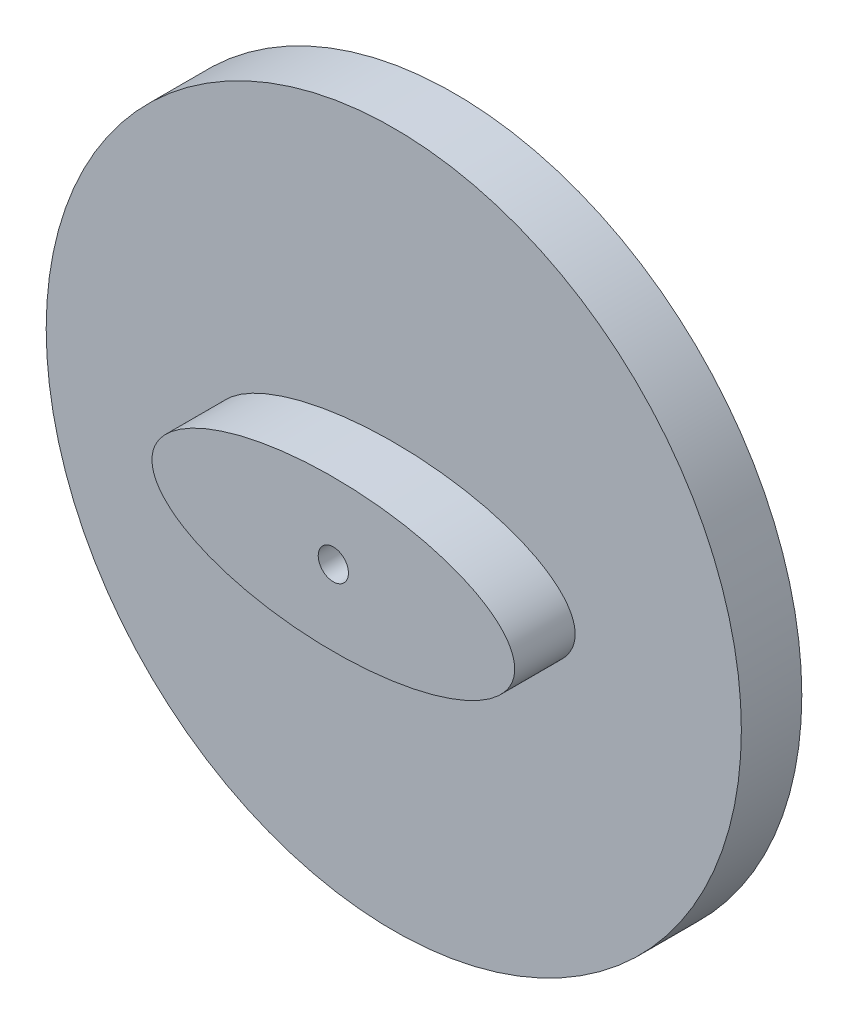
ISO-10303-21;
HEADER;
FILE_DESCRIPTION(('STEP AP214'),'2;1');
FILE_NAME('part.step','',(''),(''),'','','');
FILE_SCHEMA(('AUTOMOTIVE_DESIGN { 1 0 10303 214 1 1 1 1 }'));
ENDSEC;
DATA;
#1=APPLICATION_CONTEXT('core data for automotive mechanical design processes');
#2=APPLICATION_PROTOCOL_DEFINITION('international standard','automotive_design',2000,#1);
#3=PRODUCT_CONTEXT('',#1,'mechanical');
#4=PRODUCT('Part','Part','',(#3));
#5=PRODUCT_RELATED_PRODUCT_CATEGORY('part','',(#4));
#6=PRODUCT_DEFINITION_FORMATION('','',#4);
#7=PRODUCT_DEFINITION_CONTEXT('part definition',#1,'design');
#8=PRODUCT_DEFINITION('design','',#6,#7);
#9=PRODUCT_DEFINITION_SHAPE('','',#8);
#10=(LENGTH_UNIT() NAMED_UNIT(*) SI_UNIT(.MILLI.,.METRE.));
#11=(NAMED_UNIT(*) PLANE_ANGLE_UNIT() SI_UNIT($,.RADIAN.));
#12=(NAMED_UNIT(*) SI_UNIT($,.STERADIAN.) SOLID_ANGLE_UNIT());
#13=UNCERTAINTY_MEASURE_WITH_UNIT(LENGTH_MEASURE(1.E-05),#10,'distance_accuracy_value','');
#14=(GEOMETRIC_REPRESENTATION_CONTEXT(3) GLOBAL_UNCERTAINTY_ASSIGNED_CONTEXT((#13)) GLOBAL_UNIT_ASSIGNED_CONTEXT((#10,
#11,#12)) REPRESENTATION_CONTEXT('',''));
#15=CARTESIAN_POINT('',(0.,0.,0.));
#16=DIRECTION('',(0.,0.,1.));
#17=DIRECTION('',(1.,0.,0.));
#18=AXIS2_PLACEMENT_3D('',#15,#16,#17);
#19=CARTESIAN_POINT('',(0.,0.,2.));
#20=DIRECTION('',(0.,0.,-1.));
#21=DIRECTION('',(-1.,0.,0.));
#22=AXIS2_PLACEMENT_3D('',#19,#20,#21);
#23=CYLINDRICAL_SURFACE('',#22,11.5);
#24=CARTESIAN_POINT('',(0.,0.,2.));
#25=DIRECTION('',(0.,0.,1.));
#26=DIRECTION('',(1.,0.,0.));
#27=AXIS2_PLACEMENT_3D('',#24,#25,#26);
#28=CIRCLE('',#27,11.5);
#29=CARTESIAN_POINT('',(11.5,0.,2.));
#30=VERTEX_POINT('',#29);
#31=EDGE_CURVE('E45',#30,#30,#28,.T.);
#32=ORIENTED_EDGE('',*,*,#31,.F.);
#33=EDGE_LOOP('',(#32));
#34=FACE_BOUND('',#33,.T.);
#35=CARTESIAN_POINT('',(0.,0.,0.));
#36=DIRECTION('',(0.,0.,1.));
#37=DIRECTION('',(1.,0.,0.));
#38=AXIS2_PLACEMENT_3D('',#35,#36,#37);
#39=CIRCLE('',#38,11.5);
#40=CARTESIAN_POINT('',(11.5,0.,0.));
#41=VERTEX_POINT('',#40);
#42=EDGE_CURVE('E40',#41,#41,#39,.T.);
#43=ORIENTED_EDGE('',*,*,#42,.T.);
#44=EDGE_LOOP('',(#43));
#45=FACE_BOUND('',#44,.T.);
#46=ADVANCED_FACE('F37',(#34,#45),#23,.T.);
#47=CARTESIAN_POINT('',(0.,0.,2.));
#48=DIRECTION('',(0.,0.,1.));
#49=DIRECTION('',(1.,0.,0.));
#50=AXIS2_PLACEMENT_3D('',#47,#48,#49);
#51=PLANE('',#50);
#52=CARTESIAN_POINT('',(0.,0.,2.));
#53=DIRECTION('',(0.,0.,1.));
#54=DIRECTION('',(1.,0.,0.));
#55=AXIS2_PLACEMENT_3D('',#52,#53,#54);
#56=ELLIPSE('',#55,6.,2.5);
#57=CARTESIAN_POINT('',(6.,0.,2.));
#58=VERTEX_POINT('',#57);
#59=EDGE_CURVE('E10',#58,#58,#56,.T.);
#60=ORIENTED_EDGE('',*,*,#59,.F.);
#61=EDGE_LOOP('',(#60));
#62=FACE_BOUND('',#61,.T.);
#63=ORIENTED_EDGE('',*,*,#31,.T.);
#64=EDGE_LOOP('',(#63));
#65=FACE_BOUND('',#64,.T.);
#66=ADVANCED_FACE('F69',(#62,#65),#51,.T.);
#67=CARTESIAN_POINT('',(0.,0.,0.));
#68=DIRECTION('',(0.,0.,1.));
#69=DIRECTION('',(1.,0.,0.));
#70=AXIS2_PLACEMENT_3D('',#67,#68,#69);
#71=PLANE('',#70);
#72=CARTESIAN_POINT('',(0.,0.,0.));
#73=DIRECTION('',(0.,0.,-1.));
#74=DIRECTION('',(-1.,0.,0.));
#75=AXIS2_PLACEMENT_3D('',#72,#73,#74);
#76=CIRCLE('',#75,0.5);
#77=CARTESIAN_POINT('',(-0.5,0.,0.));
#78=VERTEX_POINT('',#77);
#79=EDGE_CURVE('E58',#78,#78,#76,.T.);
#80=ORIENTED_EDGE('',*,*,#79,.F.);
#81=EDGE_LOOP('',(#80));
#82=FACE_BOUND('',#81,.T.);
#83=ORIENTED_EDGE('',*,*,#42,.F.);
#84=EDGE_LOOP('',(#83));
#85=FACE_BOUND('',#84,.T.);
#86=ADVANCED_FACE('F66',(#82,#85),#71,.F.);
#87=CARTESIAN_POINT('',(0.,0.,4.));
#88=DIRECTION('',(0.,0.,1.));
#89=DIRECTION('',(1.,0.,0.));
#90=AXIS2_PLACEMENT_3D('',#87,#88,#89);
#91=ELLIPSE('',#90,6.,2.5);
#92=DIRECTION('',(0.,0.,-1.));
#93=VECTOR('',#92,1.);
#94=SURFACE_OF_LINEAR_EXTRUSION('',#91,#93);
#95=CARTESIAN_POINT('',(6.,0.,4.));
#96=VERTEX_POINT('',#95);
#97=EDGE_CURVE('E52',#96,#96,#91,.T.);
#98=ORIENTED_EDGE('',*,*,#97,.F.);
#99=EDGE_LOOP('',(#98));
#100=FACE_BOUND('',#99,.T.);
#101=ORIENTED_EDGE('',*,*,#59,.T.);
#102=EDGE_LOOP('',(#101));
#103=FACE_BOUND('',#102,.T.);
#104=ADVANCED_FACE('F61',(#100,#103),#94,.F.);
#105=CARTESIAN_POINT('',(0.,0.,4.));
#106=DIRECTION('',(0.,0.,1.));
#107=DIRECTION('',(1.,0.,0.));
#108=AXIS2_PLACEMENT_3D('',#105,#106,#107);
#109=PLANE('',#108);
#110=CARTESIAN_POINT('',(0.,0.,4.));
#111=DIRECTION('',(0.,0.,-1.));
#112=DIRECTION('',(-1.,0.,0.));
#113=AXIS2_PLACEMENT_3D('',#110,#111,#112);
#114=CIRCLE('',#113,0.5);
#115=CARTESIAN_POINT('',(-0.5,0.,4.));
#116=VERTEX_POINT('',#115);
#117=EDGE_CURVE('E57',#116,#116,#114,.T.);
#118=ORIENTED_EDGE('',*,*,#117,.T.);
#119=EDGE_LOOP('',(#118));
#120=FACE_BOUND('',#119,.T.);
#121=ORIENTED_EDGE('',*,*,#97,.T.);
#122=EDGE_LOOP('',(#121));
#123=FACE_BOUND('',#122,.T.);
#124=ADVANCED_FACE('F65',(#120,#123),#109,.T.);
#125=CARTESIAN_POINT('',(0.,0.,4.));
#126=DIRECTION('',(0.,0.,-1.));
#127=DIRECTION('',(-1.,0.,0.));
#128=AXIS2_PLACEMENT_3D('',#125,#126,#127);
#129=CYLINDRICAL_SURFACE('',#128,0.5);
#130=ORIENTED_EDGE('',*,*,#117,.F.);
#131=EDGE_LOOP('',(#130));
#132=FACE_BOUND('',#131,.T.);
#133=ORIENTED_EDGE('',*,*,#79,.T.);
#134=EDGE_LOOP('',(#133));
#135=FACE_BOUND('',#134,.T.);
#136=ADVANCED_FACE('F92',(#132,#135),#129,.F.);
#137=CLOSED_SHELL('',(#46,#66,#86,#104,#124,#136));
#138=MANIFOLD_SOLID_BREP('B2',#137);
#139=ADVANCED_BREP_SHAPE_REPRESENTATION('',(#18,#138),#14);
#140=SHAPE_DEFINITION_REPRESENTATION(#9,#139);
ENDSEC;
END-ISO-10303-21;
